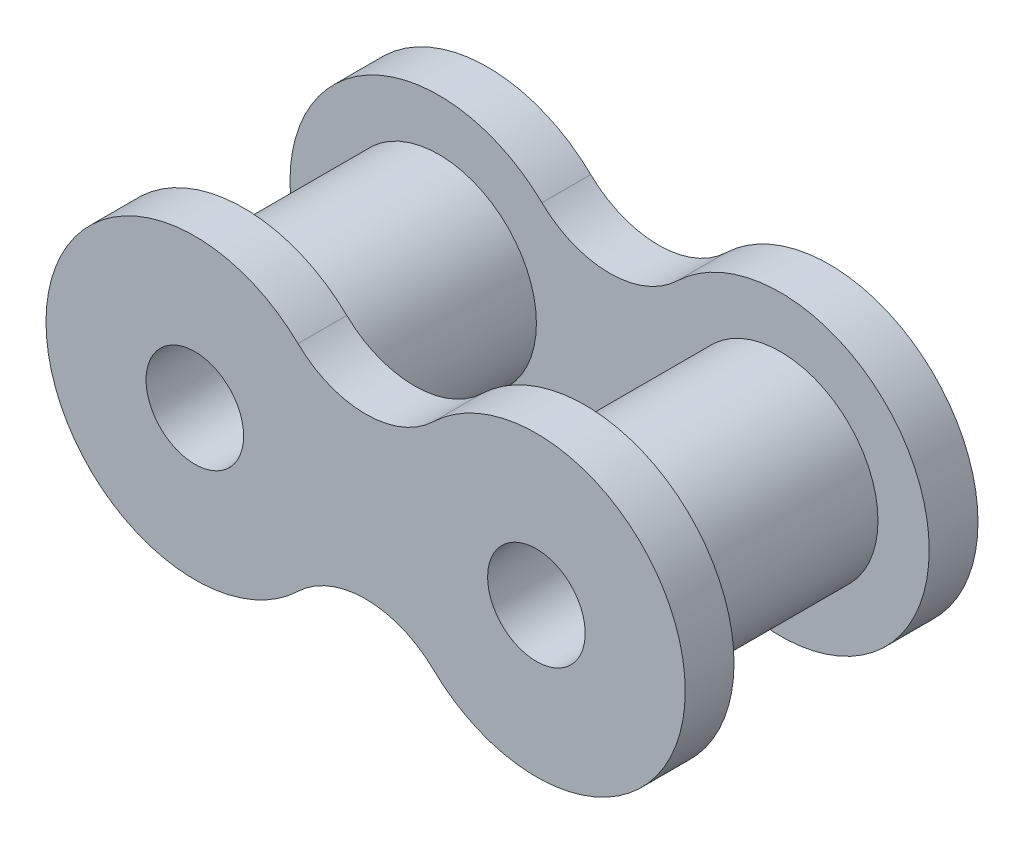
ISO-10303-21;
HEADER;
FILE_DESCRIPTION(('STEP AP214'),'2;1');
FILE_NAME('part.step','',(''),(''),'','','');
FILE_SCHEMA(('AUTOMOTIVE_DESIGN { 1 0 10303 214 1 1 1 1 }'));
ENDSEC;
DATA;
#1=APPLICATION_CONTEXT('core data for automotive mechanical design processes');
#2=APPLICATION_PROTOCOL_DEFINITION('international standard','automotive_design',2000,#1);
#3=PRODUCT_CONTEXT('',#1,'mechanical');
#4=PRODUCT('Part','Part','',(#3));
#5=PRODUCT_RELATED_PRODUCT_CATEGORY('part','',(#4));
#6=PRODUCT_DEFINITION_FORMATION('','',#4);
#7=PRODUCT_DEFINITION_CONTEXT('part definition',#1,'design');
#8=PRODUCT_DEFINITION('design','',#6,#7);
#9=PRODUCT_DEFINITION_SHAPE('','',#8);
#10=(LENGTH_UNIT() NAMED_UNIT(*) SI_UNIT(.MILLI.,.METRE.));
#11=(NAMED_UNIT(*) PLANE_ANGLE_UNIT() SI_UNIT($,.RADIAN.));
#12=(NAMED_UNIT(*) SI_UNIT($,.STERADIAN.) SOLID_ANGLE_UNIT());
#13=UNCERTAINTY_MEASURE_WITH_UNIT(LENGTH_MEASURE(1.E-05),#10,'distance_accuracy_value','');
#14=(GEOMETRIC_REPRESENTATION_CONTEXT(3) GLOBAL_UNCERTAINTY_ASSIGNED_CONTEXT((#13)) GLOBAL_UNIT_ASSIGNED_CONTEXT((#10,
#11,#12)) REPRESENTATION_CONTEXT('',''));
#15=CARTESIAN_POINT('',(0.,0.,0.));
#16=DIRECTION('',(0.,0.,1.));
#17=DIRECTION('',(1.,0.,0.));
#18=AXIS2_PLACEMENT_3D('',#15,#16,#17);
#19=CARTESIAN_POINT('',(3.5,3.64039832985348,2.));
#20=DIRECTION('',(0.,0.,1.));
#21=DIRECTION('',(1.,0.,0.));
#22=AXIS2_PLACEMENT_3D('',#19,#20,#21);
#23=PLANE('',#22);
#24=CARTESIAN_POINT('',(7.,0.,2.));
#25=DIRECTION('',(0.,0.,1.));
#26=DIRECTION('',(1.,0.,0.));
#27=AXIS2_PLACEMENT_3D('',#24,#25,#26);
#28=CIRCLE('',#27,4.);
#29=CARTESIAN_POINT('',(11.,0.,2.));
#30=VERTEX_POINT('',#29);
#31=EDGE_CURVE('E123',#30,#30,#28,.T.);
#32=ORIENTED_EDGE('',*,*,#31,.F.);
#33=EDGE_LOOP('',(#32));
#34=FACE_BOUND('',#33,.T.);
#35=CARTESIAN_POINT('',(-6.99999999999999,0.,2.));
#36=DIRECTION('',(0.,0.,1.));
#37=DIRECTION('',(1.,0.,0.));
#38=AXIS2_PLACEMENT_3D('',#35,#36,#37);
#39=CIRCLE('',#38,4.);
#40=CARTESIAN_POINT('',(-2.99999999999999,0.,2.));
#41=VERTEX_POINT('',#40);
#42=EDGE_CURVE('E165',#41,#41,#39,.T.);
#43=ORIENTED_EDGE('',*,*,#42,.F.);
#44=EDGE_LOOP('',(#43));
#45=FACE_BOUND('',#44,.T.);
#46=CARTESIAN_POINT('',(0.,7.28079665970696,2.));
#47=DIRECTION('',(0.,0.,-1.));
#48=DIRECTION('',(1.,0.,0.));
#49=AXIS2_PLACEMENT_3D('',#46,#47,#48);
#50=CIRCLE('',#49,4.);
#51=CARTESIAN_POINT('',(2.77227722772278,4.39731283408044,2.));
#52=VERTEX_POINT('',#51);
#53=CARTESIAN_POINT('',(-2.77227722772277,4.39731283408044,2.));
#54=VERTEX_POINT('',#53);
#55=EDGE_CURVE('E180',#52,#54,#50,.T.);
#56=ORIENTED_EDGE('',*,*,#55,.T.);
#57=CARTESIAN_POINT('',(-6.99999999999999,0.,2.));
#58=DIRECTION('',(0.,0.,1.));
#59=DIRECTION('',(1.,0.,0.));
#60=AXIS2_PLACEMENT_3D('',#57,#58,#59);
#61=CIRCLE('',#60,6.1);
#62=CARTESIAN_POINT('',(-2.77227722772277,-4.39731283408044,2.));
#63=VERTEX_POINT('',#62);
#64=EDGE_CURVE('E87',#54,#63,#61,.T.);
#65=ORIENTED_EDGE('',*,*,#64,.T.);
#66=CARTESIAN_POINT('',(0.,-7.28079665970696,2.));
#67=DIRECTION('',(0.,0.,-1.));
#68=DIRECTION('',(-1.,0.,0.));
#69=AXIS2_PLACEMENT_3D('',#66,#67,#68);
#70=CIRCLE('',#69,4.);
#71=CARTESIAN_POINT('',(2.77227722772278,-4.39731283408044,2.));
#72=VERTEX_POINT('',#71);
#73=EDGE_CURVE('E178',#63,#72,#70,.T.);
#74=ORIENTED_EDGE('',*,*,#73,.T.);
#75=CARTESIAN_POINT('',(7.,0.,2.));
#76=DIRECTION('',(0.,0.,1.));
#77=DIRECTION('',(-1.,0.,0.));
#78=AXIS2_PLACEMENT_3D('',#75,#76,#77);
#79=CIRCLE('',#78,6.1);
#80=EDGE_CURVE('E57',#72,#52,#79,.T.);
#81=ORIENTED_EDGE('',*,*,#80,.T.);
#82=EDGE_LOOP('',(#56,#65,#74,#81));
#83=FACE_BOUND('',#82,.T.);
#84=ADVANCED_FACE('F39',(#34,#45,#83),#23,.T.);
#85=CARTESIAN_POINT('',(3.5,3.64039832985348,0.));
#86=DIRECTION('',(0.,0.,1.));
#87=DIRECTION('',(1.,0.,0.));
#88=AXIS2_PLACEMENT_3D('',#85,#86,#87);
#89=PLANE('',#88);
#90=CARTESIAN_POINT('',(0.,7.28079665970696,0.));
#91=DIRECTION('',(0.,0.,-1.));
#92=DIRECTION('',(1.,0.,0.));
#93=AXIS2_PLACEMENT_3D('',#90,#91,#92);
#94=CIRCLE('',#93,4.);
#95=CARTESIAN_POINT('',(2.77227722772278,4.39731283408044,0.));
#96=VERTEX_POINT('',#95);
#97=CARTESIAN_POINT('',(-2.77227722772277,4.39731283408044,0.));
#98=VERTEX_POINT('',#97);
#99=EDGE_CURVE('E177',#96,#98,#94,.T.);
#100=ORIENTED_EDGE('',*,*,#99,.F.);
#101=CARTESIAN_POINT('',(7.,0.,0.));
#102=DIRECTION('',(0.,0.,1.));
#103=DIRECTION('',(-1.,0.,0.));
#104=AXIS2_PLACEMENT_3D('',#101,#102,#103);
#105=CIRCLE('',#104,6.1);
#106=CARTESIAN_POINT('',(2.77227722772278,-4.39731283408044,0.));
#107=VERTEX_POINT('',#106);
#108=EDGE_CURVE('E78',#107,#96,#105,.T.);
#109=ORIENTED_EDGE('',*,*,#108,.F.);
#110=CARTESIAN_POINT('',(0.,-7.28079665970696,0.));
#111=DIRECTION('',(0.,0.,-1.));
#112=DIRECTION('',(-1.,0.,0.));
#113=AXIS2_PLACEMENT_3D('',#110,#111,#112);
#114=CIRCLE('',#113,4.);
#115=CARTESIAN_POINT('',(-2.77227722772277,-4.39731283408044,0.));
#116=VERTEX_POINT('',#115);
#117=EDGE_CURVE('E74',#116,#107,#114,.T.);
#118=ORIENTED_EDGE('',*,*,#117,.F.);
#119=CARTESIAN_POINT('',(-6.99999999999999,0.,0.));
#120=DIRECTION('',(0.,0.,1.));
#121=DIRECTION('',(1.,0.,0.));
#122=AXIS2_PLACEMENT_3D('',#119,#120,#121);
#123=CIRCLE('',#122,6.1);
#124=EDGE_CURVE('E187',#98,#116,#123,.T.);
#125=ORIENTED_EDGE('',*,*,#124,.F.);
#126=EDGE_LOOP('',(#100,#109,#118,#125));
#127=FACE_BOUND('',#126,.T.);
#128=CARTESIAN_POINT('',(-6.99999999999999,0.,0.));
#129=DIRECTION('',(0.,0.,1.));
#130=DIRECTION('',(1.,0.,0.));
#131=AXIS2_PLACEMENT_3D('',#128,#129,#130);
#132=CIRCLE('',#131,2.);
#133=CARTESIAN_POINT('',(-4.99999999999999,0.,0.));
#134=VERTEX_POINT('',#133);
#135=EDGE_CURVE('E174',#134,#134,#132,.T.);
#136=ORIENTED_EDGE('',*,*,#135,.T.);
#137=EDGE_LOOP('',(#136));
#138=FACE_BOUND('',#137,.T.);
#139=CARTESIAN_POINT('',(7.,0.,0.));
#140=DIRECTION('',(0.,0.,1.));
#141=DIRECTION('',(-1.,0.,0.));
#142=AXIS2_PLACEMENT_3D('',#139,#140,#141);
#143=CIRCLE('',#142,2.);
#144=CARTESIAN_POINT('',(5.,0.,0.));
#145=VERTEX_POINT('',#144);
#146=EDGE_CURVE('E169',#145,#145,#143,.T.);
#147=ORIENTED_EDGE('',*,*,#146,.T.);
#148=EDGE_LOOP('',(#147));
#149=FACE_BOUND('',#148,.T.);
#150=ADVANCED_FACE('F198',(#127,#138,#149),#89,.F.);
#151=CARTESIAN_POINT('',(0.,7.28079665970696,2.));
#152=DIRECTION('',(0.,0.,-1.));
#153=DIRECTION('',(-1.,0.,0.));
#154=AXIS2_PLACEMENT_3D('',#151,#152,#153);
#155=CYLINDRICAL_SURFACE('',#154,4.);
#156=ORIENTED_EDGE('',*,*,#99,.T.);
#157=DIRECTION('',(0.,0.,-1.));
#158=VECTOR('',#157,1.);
#159=CARTESIAN_POINT('',(-2.77227722772277,4.39731283408044,2.));
#160=LINE('',#159,#158);
#161=EDGE_CURVE('E11',#54,#98,#160,.T.);
#162=ORIENTED_EDGE('',*,*,#161,.F.);
#163=ORIENTED_EDGE('',*,*,#55,.F.);
#164=DIRECTION('',(0.,0.,-1.));
#165=VECTOR('',#164,1.);
#166=CARTESIAN_POINT('',(2.77227722772278,4.39731283408044,2.));
#167=LINE('',#166,#165);
#168=EDGE_CURVE('E181',#52,#96,#167,.T.);
#169=ORIENTED_EDGE('',*,*,#168,.T.);
#170=EDGE_LOOP('',(#156,#162,#163,#169));
#171=FACE_BOUND('',#170,.T.);
#172=ADVANCED_FACE('F41',(#171),#155,.F.);
#173=CARTESIAN_POINT('',(-6.99999999999999,0.,2.));
#174=DIRECTION('',(0.,0.,-1.));
#175=DIRECTION('',(-1.,0.,0.));
#176=AXIS2_PLACEMENT_3D('',#173,#174,#175);
#177=CYLINDRICAL_SURFACE('',#176,6.1);
#178=ORIENTED_EDGE('',*,*,#124,.T.);
#179=DIRECTION('',(0.,0.,-1.));
#180=VECTOR('',#179,1.);
#181=CARTESIAN_POINT('',(-2.77227722772277,-4.39731283408044,2.));
#182=LINE('',#181,#180);
#183=EDGE_CURVE('E48',#63,#116,#182,.T.);
#184=ORIENTED_EDGE('',*,*,#183,.F.);
#185=ORIENTED_EDGE('',*,*,#64,.F.);
#186=ORIENTED_EDGE('',*,*,#161,.T.);
#187=EDGE_LOOP('',(#178,#184,#185,#186));
#188=FACE_BOUND('',#187,.T.);
#189=ADVANCED_FACE('F213',(#188),#177,.T.);
#190=CARTESIAN_POINT('',(0.,-7.28079665970696,2.));
#191=DIRECTION('',(0.,0.,-1.));
#192=DIRECTION('',(-1.,0.,0.));
#193=AXIS2_PLACEMENT_3D('',#190,#191,#192);
#194=CYLINDRICAL_SURFACE('',#193,4.);
#195=ORIENTED_EDGE('',*,*,#117,.T.);
#196=DIRECTION('',(0.,0.,-1.));
#197=VECTOR('',#196,1.);
#198=CARTESIAN_POINT('',(2.77227722772278,-4.39731283408044,2.));
#199=LINE('',#198,#197);
#200=EDGE_CURVE('E192',#72,#107,#199,.T.);
#201=ORIENTED_EDGE('',*,*,#200,.F.);
#202=ORIENTED_EDGE('',*,*,#73,.F.);
#203=ORIENTED_EDGE('',*,*,#183,.T.);
#204=EDGE_LOOP('',(#195,#201,#202,#203));
#205=FACE_BOUND('',#204,.T.);
#206=ADVANCED_FACE('F194',(#205),#194,.F.);
#207=CARTESIAN_POINT('',(7.,0.,2.));
#208=DIRECTION('',(0.,0.,-1.));
#209=DIRECTION('',(-1.,0.,0.));
#210=AXIS2_PLACEMENT_3D('',#207,#208,#209);
#211=CYLINDRICAL_SURFACE('',#210,6.1);
#212=ORIENTED_EDGE('',*,*,#108,.T.);
#213=ORIENTED_EDGE('',*,*,#168,.F.);
#214=ORIENTED_EDGE('',*,*,#80,.F.);
#215=ORIENTED_EDGE('',*,*,#200,.T.);
#216=EDGE_LOOP('',(#212,#213,#214,#215));
#217=FACE_BOUND('',#216,.T.);
#218=ADVANCED_FACE('F203',(#217),#211,.T.);
#219=CARTESIAN_POINT('',(-6.99999999999999,0.,2.));
#220=DIRECTION('',(0.,0.,-1.));
#221=DIRECTION('',(-1.,0.,0.));
#222=AXIS2_PLACEMENT_3D('',#219,#220,#221);
#223=CYLINDRICAL_SURFACE('',#222,2.);
#224=ORIENTED_EDGE('',*,*,#135,.F.);
#225=EDGE_LOOP('',(#224));
#226=FACE_BOUND('',#225,.T.);
#227=CARTESIAN_POINT('',(-6.99999999999999,0.,12.));
#228=DIRECTION('',(0.,0.,1.));
#229=DIRECTION('',(1.,0.,0.));
#230=AXIS2_PLACEMENT_3D('',#227,#228,#229);
#231=CIRCLE('',#230,2.);
#232=CARTESIAN_POINT('',(-4.99999999999999,0.,12.));
#233=VERTEX_POINT('',#232);
#234=EDGE_CURVE('E146',#233,#233,#231,.T.);
#235=ORIENTED_EDGE('',*,*,#234,.T.);
#236=EDGE_LOOP('',(#235));
#237=FACE_BOUND('',#236,.T.);
#238=ADVANCED_FACE('F201',(#226,#237),#223,.F.);
#239=CARTESIAN_POINT('',(7.,0.,2.));
#240=DIRECTION('',(0.,0.,-1.));
#241=DIRECTION('',(-1.,0.,0.));
#242=AXIS2_PLACEMENT_3D('',#239,#240,#241);
#243=CYLINDRICAL_SURFACE('',#242,2.);
#244=ORIENTED_EDGE('',*,*,#146,.F.);
#245=EDGE_LOOP('',(#244));
#246=FACE_BOUND('',#245,.T.);
#247=CARTESIAN_POINT('',(7.,0.,12.));
#248=DIRECTION('',(0.,0.,1.));
#249=DIRECTION('',(-1.,0.,0.));
#250=AXIS2_PLACEMENT_3D('',#247,#248,#249);
#251=CIRCLE('',#250,2.);
#252=CARTESIAN_POINT('',(5.,0.,12.));
#253=VERTEX_POINT('',#252);
#254=EDGE_CURVE('E345',#253,#253,#251,.T.);
#255=ORIENTED_EDGE('',*,*,#254,.T.);
#256=EDGE_LOOP('',(#255));
#257=FACE_BOUND('',#256,.T.);
#258=ADVANCED_FACE('F209',(#246,#257),#243,.F.);
#259=CARTESIAN_POINT('',(-6.99999999999999,0.,10.));
#260=DIRECTION('',(0.,0.,-1.));
#261=DIRECTION('',(-1.,0.,0.));
#262=AXIS2_PLACEMENT_3D('',#259,#260,#261);
#263=CYLINDRICAL_SURFACE('',#262,4.);
#264=CARTESIAN_POINT('',(-6.99999999999999,0.,10.));
#265=DIRECTION('',(0.,0.,1.));
#266=DIRECTION('',(1.,0.,0.));
#267=AXIS2_PLACEMENT_3D('',#264,#265,#266);
#268=CIRCLE('',#267,4.);
#269=CARTESIAN_POINT('',(-2.99999999999999,0.,10.));
#270=VERTEX_POINT('',#269);
#271=EDGE_CURVE('E164',#270,#270,#268,.T.);
#272=ORIENTED_EDGE('',*,*,#271,.F.);
#273=EDGE_LOOP('',(#272));
#274=FACE_BOUND('',#273,.T.);
#275=ORIENTED_EDGE('',*,*,#42,.T.);
#276=EDGE_LOOP('',(#275));
#277=FACE_BOUND('',#276,.T.);
#278=ADVANCED_FACE('F230',(#274,#277),#263,.T.);
#279=CARTESIAN_POINT('',(7.,0.,10.));
#280=DIRECTION('',(0.,0.,-1.));
#281=DIRECTION('',(-1.,0.,0.));
#282=AXIS2_PLACEMENT_3D('',#279,#280,#281);
#283=CYLINDRICAL_SURFACE('',#282,4.);
#284=CARTESIAN_POINT('',(7.,0.,10.));
#285=DIRECTION('',(0.,0.,1.));
#286=DIRECTION('',(1.,0.,0.));
#287=AXIS2_PLACEMENT_3D('',#284,#285,#286);
#288=CIRCLE('',#287,4.);
#289=CARTESIAN_POINT('',(11.,0.,10.));
#290=VERTEX_POINT('',#289);
#291=EDGE_CURVE('E157',#290,#290,#288,.T.);
#292=ORIENTED_EDGE('',*,*,#291,.F.);
#293=EDGE_LOOP('',(#292));
#294=FACE_BOUND('',#293,.T.);
#295=ORIENTED_EDGE('',*,*,#31,.T.);
#296=EDGE_LOOP('',(#295));
#297=FACE_BOUND('',#296,.T.);
#298=ADVANCED_FACE('F228',(#294,#297),#283,.T.);
#299=CARTESIAN_POINT('',(0.,7.28079665970696,10.));
#300=DIRECTION('',(0.,0.,1.));
#301=DIRECTION('',(1.,0.,0.));
#302=AXIS2_PLACEMENT_3D('',#299,#300,#301);
#303=CYLINDRICAL_SURFACE('',#302,4.);
#304=CARTESIAN_POINT('',(0.,7.28079665970696,12.));
#305=DIRECTION('',(0.,0.,-1.));
#306=DIRECTION('',(1.,0.,0.));
#307=AXIS2_PLACEMENT_3D('',#304,#305,#306);
#308=CIRCLE('',#307,4.);
#309=CARTESIAN_POINT('',(2.77227722772278,4.39731283408044,12.));
#310=VERTEX_POINT('',#309);
#311=CARTESIAN_POINT('',(-2.77227722772277,4.39731283408044,12.));
#312=VERTEX_POINT('',#311);
#313=EDGE_CURVE('E118',#310,#312,#308,.T.);
#314=ORIENTED_EDGE('',*,*,#313,.F.);
#315=DIRECTION('',(0.,0.,1.));
#316=VECTOR('',#315,1.);
#317=CARTESIAN_POINT('',(2.77227722772278,4.39731283408044,10.));
#318=LINE('',#317,#316);
#319=CARTESIAN_POINT('',(2.77227722772278,4.39731283408044,10.));
#320=VERTEX_POINT('',#319);
#321=EDGE_CURVE('E111',#320,#310,#318,.T.);
#322=ORIENTED_EDGE('',*,*,#321,.F.);
#323=CARTESIAN_POINT('',(0.,7.28079665970696,10.));
#324=DIRECTION('',(0.,0.,-1.));
#325=DIRECTION('',(1.,0.,0.));
#326=AXIS2_PLACEMENT_3D('',#323,#324,#325);
#327=CIRCLE('',#326,4.);
#328=CARTESIAN_POINT('',(-2.77227722772277,4.39731283408044,10.));
#329=VERTEX_POINT('',#328);
#330=EDGE_CURVE('E120',#320,#329,#327,.T.);
#331=ORIENTED_EDGE('',*,*,#330,.T.);
#332=DIRECTION('',(0.,0.,1.));
#333=VECTOR('',#332,1.);
#334=CARTESIAN_POINT('',(-2.77227722772277,4.39731283408044,10.));
#335=LINE('',#334,#333);
#336=EDGE_CURVE('E144',#329,#312,#335,.T.);
#337=ORIENTED_EDGE('',*,*,#336,.T.);
#338=EDGE_LOOP('',(#314,#322,#331,#337));
#339=FACE_BOUND('',#338,.T.);
#340=ADVANCED_FACE('F117',(#339),#303,.F.);
#341=CARTESIAN_POINT('',(7.,0.,10.));
#342=DIRECTION('',(0.,0.,1.));
#343=DIRECTION('',(1.,0.,0.));
#344=AXIS2_PLACEMENT_3D('',#341,#342,#343);
#345=CYLINDRICAL_SURFACE('',#344,6.1);
#346=CARTESIAN_POINT('',(7.,0.,12.));
#347=DIRECTION('',(0.,0.,1.));
#348=DIRECTION('',(-1.,0.,0.));
#349=AXIS2_PLACEMENT_3D('',#346,#347,#348);
#350=CIRCLE('',#349,6.1);
#351=CARTESIAN_POINT('',(2.77227722772278,-4.39731283408044,12.));
#352=VERTEX_POINT('',#351);
#353=EDGE_CURVE('E150',#352,#310,#350,.T.);
#354=ORIENTED_EDGE('',*,*,#353,.F.);
#355=DIRECTION('',(0.,0.,1.));
#356=VECTOR('',#355,1.);
#357=CARTESIAN_POINT('',(2.77227722772278,-4.39731283408044,10.));
#358=LINE('',#357,#356);
#359=CARTESIAN_POINT('',(2.77227722772278,-4.39731283408044,10.));
#360=VERTEX_POINT('',#359);
#361=EDGE_CURVE('E127',#360,#352,#358,.T.);
#362=ORIENTED_EDGE('',*,*,#361,.F.);
#363=CARTESIAN_POINT('',(7.,0.,10.));
#364=DIRECTION('',(0.,0.,1.));
#365=DIRECTION('',(-1.,0.,0.));
#366=AXIS2_PLACEMENT_3D('',#363,#364,#365);
#367=CIRCLE('',#366,6.1);
#368=EDGE_CURVE('E135',#360,#320,#367,.T.);
#369=ORIENTED_EDGE('',*,*,#368,.T.);
#370=ORIENTED_EDGE('',*,*,#321,.T.);
#371=EDGE_LOOP('',(#354,#362,#369,#370));
#372=FACE_BOUND('',#371,.T.);
#373=ADVANCED_FACE('F139',(#372),#345,.T.);
#374=CARTESIAN_POINT('',(0.,-7.28079665970696,10.));
#375=DIRECTION('',(0.,0.,1.));
#376=DIRECTION('',(1.,0.,0.));
#377=AXIS2_PLACEMENT_3D('',#374,#375,#376);
#378=CYLINDRICAL_SURFACE('',#377,4.);
#379=CARTESIAN_POINT('',(0.,-7.28079665970696,12.));
#380=DIRECTION('',(0.,0.,-1.));
#381=DIRECTION('',(-1.,0.,0.));
#382=AXIS2_PLACEMENT_3D('',#379,#380,#381);
#383=CIRCLE('',#382,4.);
#384=CARTESIAN_POINT('',(-2.77227722772277,-4.39731283408044,12.));
#385=VERTEX_POINT('',#384);
#386=EDGE_CURVE('E147',#385,#352,#383,.T.);
#387=ORIENTED_EDGE('',*,*,#386,.F.);
#388=DIRECTION('',(0.,0.,1.));
#389=VECTOR('',#388,1.);
#390=CARTESIAN_POINT('',(-2.77227722772277,-4.39731283408044,10.));
#391=LINE('',#390,#389);
#392=CARTESIAN_POINT('',(-2.77227722772277,-4.39731283408044,10.));
#393=VERTEX_POINT('',#392);
#394=EDGE_CURVE('E156',#393,#385,#391,.T.);
#395=ORIENTED_EDGE('',*,*,#394,.F.);
#396=CARTESIAN_POINT('',(0.,-7.28079665970696,10.));
#397=DIRECTION('',(0.,0.,-1.));
#398=DIRECTION('',(-1.,0.,0.));
#399=AXIS2_PLACEMENT_3D('',#396,#397,#398);
#400=CIRCLE('',#399,4.);
#401=EDGE_CURVE('E136',#393,#360,#400,.T.);
#402=ORIENTED_EDGE('',*,*,#401,.T.);
#403=ORIENTED_EDGE('',*,*,#361,.T.);
#404=EDGE_LOOP('',(#387,#395,#402,#403));
#405=FACE_BOUND('',#404,.T.);
#406=ADVANCED_FACE('F239',(#405),#378,.F.);
#407=CARTESIAN_POINT('',(-6.99999999999999,0.,10.));
#408=DIRECTION('',(0.,0.,1.));
#409=DIRECTION('',(1.,0.,0.));
#410=AXIS2_PLACEMENT_3D('',#407,#408,#409);
#411=CYLINDRICAL_SURFACE('',#410,6.1);
#412=CARTESIAN_POINT('',(-6.99999999999999,0.,12.));
#413=DIRECTION('',(0.,0.,1.));
#414=DIRECTION('',(1.,0.,0.));
#415=AXIS2_PLACEMENT_3D('',#412,#413,#414);
#416=CIRCLE('',#415,6.1);
#417=EDGE_CURVE('E137',#312,#385,#416,.T.);
#418=ORIENTED_EDGE('',*,*,#417,.F.);
#419=ORIENTED_EDGE('',*,*,#336,.F.);
#420=CARTESIAN_POINT('',(-6.99999999999999,0.,10.));
#421=DIRECTION('',(0.,0.,1.));
#422=DIRECTION('',(1.,0.,0.));
#423=AXIS2_PLACEMENT_3D('',#420,#421,#422);
#424=CIRCLE('',#423,6.1);
#425=EDGE_CURVE('E133',#329,#393,#424,.T.);
#426=ORIENTED_EDGE('',*,*,#425,.T.);
#427=ORIENTED_EDGE('',*,*,#394,.T.);
#428=EDGE_LOOP('',(#418,#419,#426,#427));
#429=FACE_BOUND('',#428,.T.);
#430=ADVANCED_FACE('F245',(#429),#411,.T.);
#431=CARTESIAN_POINT('',(3.5,3.64039832985348,10.));
#432=DIRECTION('',(0.,0.,-1.));
#433=DIRECTION('',(1.,0.,0.));
#434=AXIS2_PLACEMENT_3D('',#431,#432,#433);
#435=PLANE('',#434);
#436=ORIENTED_EDGE('',*,*,#271,.T.);
#437=EDGE_LOOP('',(#436));
#438=FACE_BOUND('',#437,.T.);
#439=ORIENTED_EDGE('',*,*,#291,.T.);
#440=EDGE_LOOP('',(#439));
#441=FACE_BOUND('',#440,.T.);
#442=ORIENTED_EDGE('',*,*,#330,.F.);
#443=ORIENTED_EDGE('',*,*,#368,.F.);
#444=ORIENTED_EDGE('',*,*,#401,.F.);
#445=ORIENTED_EDGE('',*,*,#425,.F.);
#446=EDGE_LOOP('',(#442,#443,#444,#445));
#447=FACE_BOUND('',#446,.T.);
#448=ADVANCED_FACE('F128',(#438,#441,#447),#435,.T.);
#449=CARTESIAN_POINT('',(3.5,3.64039832985348,12.));
#450=DIRECTION('',(0.,0.,-1.));
#451=DIRECTION('',(1.,0.,0.));
#452=AXIS2_PLACEMENT_3D('',#449,#450,#451);
#453=PLANE('',#452);
#454=ORIENTED_EDGE('',*,*,#254,.F.);
#455=EDGE_LOOP('',(#454));
#456=FACE_BOUND('',#455,.T.);
#457=ORIENTED_EDGE('',*,*,#234,.F.);
#458=EDGE_LOOP('',(#457));
#459=FACE_BOUND('',#458,.T.);
#460=ORIENTED_EDGE('',*,*,#313,.T.);
#461=ORIENTED_EDGE('',*,*,#417,.T.);
#462=ORIENTED_EDGE('',*,*,#386,.T.);
#463=ORIENTED_EDGE('',*,*,#353,.T.);
#464=EDGE_LOOP('',(#460,#461,#462,#463));
#465=FACE_BOUND('',#464,.T.);
#466=ADVANCED_FACE('F250',(#456,#459,#465),#453,.F.);
#467=CLOSED_SHELL('',(#84,#150,#172,#189,#206,#218,#238,#258,#278,#298,#340,#373,#406,#430,#448,#466));
#468=MANIFOLD_SOLID_BREP('B2',#467);
#469=ADVANCED_BREP_SHAPE_REPRESENTATION('',(#18,#468),#14);
#470=SHAPE_DEFINITION_REPRESENTATION(#9,#469);
ENDSEC;
END-ISO-10303-21;
